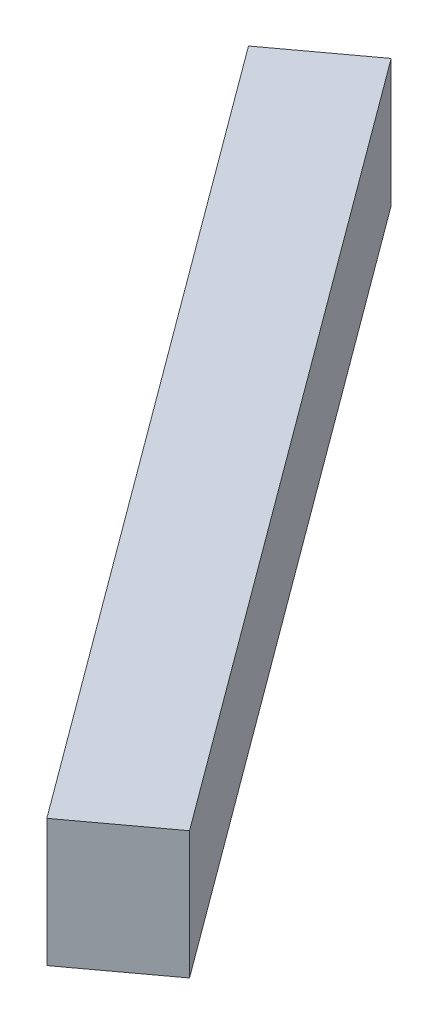
ISO-10303-21;
HEADER;
FILE_DESCRIPTION(('STEP AP214'),'2;1');
FILE_NAME('part.step','',(''),(''),'','','');
FILE_SCHEMA(('AUTOMOTIVE_DESIGN { 1 0 10303 214 1 1 1 1 }'));
ENDSEC;
DATA;
#1=APPLICATION_CONTEXT('core data for automotive mechanical design processes');
#2=APPLICATION_PROTOCOL_DEFINITION('international standard','automotive_design',2000,#1);
#3=PRODUCT_CONTEXT('',#1,'mechanical');
#4=PRODUCT('Part','Part','',(#3));
#5=PRODUCT_RELATED_PRODUCT_CATEGORY('part','',(#4));
#6=PRODUCT_DEFINITION_FORMATION('','',#4);
#7=PRODUCT_DEFINITION_CONTEXT('part definition',#1,'design');
#8=PRODUCT_DEFINITION('design','',#6,#7);
#9=PRODUCT_DEFINITION_SHAPE('','',#8);
#10=(LENGTH_UNIT() NAMED_UNIT(*) SI_UNIT(.MILLI.,.METRE.));
#11=(NAMED_UNIT(*) PLANE_ANGLE_UNIT() SI_UNIT($,.RADIAN.));
#12=(NAMED_UNIT(*) SI_UNIT($,.STERADIAN.) SOLID_ANGLE_UNIT());
#13=UNCERTAINTY_MEASURE_WITH_UNIT(LENGTH_MEASURE(1.E-05),#10,'distance_accuracy_value','');
#14=(GEOMETRIC_REPRESENTATION_CONTEXT(3) GLOBAL_UNCERTAINTY_ASSIGNED_CONTEXT((#13)) GLOBAL_UNIT_ASSIGNED_CONTEXT((#10,
#11,#12)) REPRESENTATION_CONTEXT('',''));
#15=CARTESIAN_POINT('',(0.,0.,0.));
#16=DIRECTION('',(0.,0.,1.));
#17=DIRECTION('',(1.,0.,0.));
#18=AXIS2_PLACEMENT_3D('',#15,#16,#17);
#19=CARTESIAN_POINT('',(-10.7673404934118,7.874,-14.4207640742536));
#20=DIRECTION('',(0.804603702078381,0.,-0.593812161042331));
#21=DIRECTION('',(-0.593812161042331,0.,-0.804603702078381));
#22=AXIS2_PLACEMENT_3D('',#19,#20,#21);
#23=PLANE('',#22);
#24=DIRECTION('',(0.,1.,0.));
#25=VECTOR('',#24,1.);
#26=CARTESIAN_POINT('',(-10.7673404934118,7.874,-14.4207640742536));
#27=LINE('',#26,#25);
#28=CARTESIAN_POINT('',(-10.7673404934118,7.62,-14.4207640742536));
#29=VERTEX_POINT('',#28);
#30=CARTESIAN_POINT('',(-10.7673404934118,7.874,-14.4207640742536));
#31=VERTEX_POINT('',#30);
#32=EDGE_CURVE('E20',#29,#31,#27,.T.);
#33=ORIENTED_EDGE('',*,*,#32,.T.);
#34=DIRECTION('',(0.593812161042297,0.,0.804603702078407));
#35=VECTOR('',#34,1.);
#36=CARTESIAN_POINT('',(-11.8985526601974,7.874,-15.953534126713));
#37=LINE('',#36,#35);
#38=CARTESIAN_POINT('',(-11.8985526601974,7.874,-15.953534126713));
#39=VERTEX_POINT('',#38);
#40=EDGE_CURVE('E55',#39,#31,#37,.T.);
#41=ORIENTED_EDGE('',*,*,#40,.F.);
#42=DIRECTION('',(0.,1.,0.));
#43=VECTOR('',#42,1.);
#44=CARTESIAN_POINT('',(-11.8985526601974,7.874,-15.953534126713));
#45=LINE('',#44,#43);
#46=CARTESIAN_POINT('',(-11.8985526601974,7.62,-15.953534126713));
#47=VERTEX_POINT('',#46);
#48=EDGE_CURVE('E76',#39,#47,#45,.F.);
#49=ORIENTED_EDGE('',*,*,#48,.T.);
#50=DIRECTION('',(0.593812161042297,0.,0.804603702078407));
#51=VECTOR('',#50,1.);
#52=CARTESIAN_POINT('',(-11.8985526601974,7.62,-15.953534126713));
#53=LINE('',#52,#51);
#54=EDGE_CURVE('E58',#47,#29,#53,.T.);
#55=ORIENTED_EDGE('',*,*,#54,.T.);
#56=EDGE_LOOP('',(#33,#41,#49,#55));
#57=FACE_BOUND('',#56,.T.);
#58=ADVANCED_FACE('F17',(#57),#23,.F.);
#59=CARTESIAN_POINT('',(-10.7673404934118,7.874,-14.4207640742536));
#60=DIRECTION('',(-0.593812161042352,0.,-0.804603702078366));
#61=DIRECTION('',(-0.804603702078366,0.,0.593812161042352));
#62=AXIS2_PLACEMENT_3D('',#59,#60,#61);
#63=PLANE('',#62);
#64=DIRECTION('',(0.,1.,0.));
#65=VECTOR('',#64,1.);
#66=CARTESIAN_POINT('',(-10.6038450211494,7.874,-14.5414267053774));
#67=LINE('',#66,#65);
#68=CARTESIAN_POINT('',(-10.6038450211494,7.62,-14.5414267053774));
#69=VERTEX_POINT('',#68);
#70=CARTESIAN_POINT('',(-10.6038450211494,7.874,-14.5414267053774));
#71=VERTEX_POINT('',#70);
#72=EDGE_CURVE('E73',#69,#71,#67,.T.);
#73=ORIENTED_EDGE('',*,*,#72,.T.);
#74=DIRECTION('',(0.804603702078511,0.,-0.593812161042156));
#75=VECTOR('',#74,1.);
#76=CARTESIAN_POINT('',(-10.7673404934118,7.874,-14.4207640742536));
#77=LINE('',#76,#75);
#78=EDGE_CURVE('E63',#31,#71,#77,.T.);
#79=ORIENTED_EDGE('',*,*,#78,.F.);
#80=ORIENTED_EDGE('',*,*,#32,.F.);
#81=DIRECTION('',(0.804603702078511,0.,-0.593812161042156));
#82=VECTOR('',#81,1.);
#83=CARTESIAN_POINT('',(-10.7673404934118,7.62,-14.4207640742536));
#84=LINE('',#83,#82);
#85=EDGE_CURVE('E80',#29,#69,#84,.T.);
#86=ORIENTED_EDGE('',*,*,#85,.T.);
#87=EDGE_LOOP('',(#73,#79,#80,#86));
#88=FACE_BOUND('',#87,.T.);
#89=ADVANCED_FACE('F72',(#88),#63,.F.);
#90=CARTESIAN_POINT('',(-10.6038450211494,7.874,-14.5414267053774));
#91=DIRECTION('',(0.,1.,0.));
#92=DIRECTION('',(0.,0.,1.));
#93=AXIS2_PLACEMENT_3D('',#90,#91,#92);
#94=PLANE('',#93);
#95=DIRECTION('',(0.804603701174414,0.,-0.593812162267188));
#96=VECTOR('',#95,1.);
#97=CARTESIAN_POINT('',(-11.8985526601974,7.874,-15.953534126713));
#98=LINE('',#97,#96);
#99=CARTESIAN_POINT('',(-11.7350571881188,7.874,-16.0741967580857));
#100=VERTEX_POINT('',#99);
#101=EDGE_CURVE('E69',#100,#39,#98,.F.);
#102=ORIENTED_EDGE('',*,*,#101,.T.);
#103=ORIENTED_EDGE('',*,*,#40,.T.);
#104=ORIENTED_EDGE('',*,*,#78,.T.);
#105=DIRECTION('',(0.593812161042333,0.,0.80460370207838));
#106=VECTOR('',#105,1.);
#107=CARTESIAN_POINT('',(-10.6038450211494,7.874,-14.5414267053774));
#108=LINE('',#107,#106);
#109=EDGE_CURVE('E83',#71,#100,#108,.F.);
#110=ORIENTED_EDGE('',*,*,#109,.T.);
#111=EDGE_LOOP('',(#102,#103,#104,#110));
#112=FACE_BOUND('',#111,.T.);
#113=ADVANCED_FACE('F66',(#112),#94,.T.);
#114=CARTESIAN_POINT('',(-11.8985526601974,7.874,-15.953534126713));
#115=DIRECTION('',(0.593812162267188,0.,0.804603701174415));
#116=DIRECTION('',(0.804603701174414,0.,-0.593812162267188));
#117=AXIS2_PLACEMENT_3D('',#114,#115,#116);
#118=PLANE('',#117);
#119=ORIENTED_EDGE('',*,*,#48,.F.);
#120=ORIENTED_EDGE('',*,*,#101,.F.);
#121=DIRECTION('',(0.,1.,0.));
#122=VECTOR('',#121,1.);
#123=CARTESIAN_POINT('',(-11.7350571881188,7.874,-16.0741967580857));
#124=LINE('',#123,#122);
#125=CARTESIAN_POINT('',(-11.7350571881188,7.62,-16.0741967580857));
#126=VERTEX_POINT('',#125);
#127=EDGE_CURVE('E26',#100,#126,#124,.F.);
#128=ORIENTED_EDGE('',*,*,#127,.T.);
#129=DIRECTION('',(-0.804603701174323,0.,0.593812162267312));
#130=VECTOR('',#129,1.);
#131=CARTESIAN_POINT('',(-11.7350571881188,7.62,-16.0741967580857));
#132=LINE('',#131,#130);
#133=EDGE_CURVE('E34',#126,#47,#132,.T.);
#134=ORIENTED_EDGE('',*,*,#133,.T.);
#135=EDGE_LOOP('',(#119,#120,#128,#134));
#136=FACE_BOUND('',#135,.T.);
#137=ADVANCED_FACE('F88',(#136),#118,.F.);
#138=CARTESIAN_POINT('',(-10.6038450211494,7.62,-14.5414267053774));
#139=DIRECTION('',(0.,1.,0.));
#140=DIRECTION('',(0.,0.,1.));
#141=AXIS2_PLACEMENT_3D('',#138,#139,#140);
#142=PLANE('',#141);
#143=ORIENTED_EDGE('',*,*,#54,.F.);
#144=ORIENTED_EDGE('',*,*,#133,.F.);
#145=DIRECTION('',(0.593812161042333,0.,0.80460370207838));
#146=VECTOR('',#145,1.);
#147=CARTESIAN_POINT('',(-10.6038450211494,7.62,-14.5414267053774));
#148=LINE('',#147,#146);
#149=EDGE_CURVE('E11',#126,#69,#148,.T.);
#150=ORIENTED_EDGE('',*,*,#149,.T.);
#151=ORIENTED_EDGE('',*,*,#85,.F.);
#152=EDGE_LOOP('',(#143,#144,#150,#151));
#153=FACE_BOUND('',#152,.T.);
#154=ADVANCED_FACE('F91',(#153),#142,.F.);
#155=CARTESIAN_POINT('',(-10.6038450211494,7.874,-14.5414267053774));
#156=DIRECTION('',(-0.80460370207838,0.,0.593812161042333));
#157=DIRECTION('',(0.593812161042333,0.,0.80460370207838));
#158=AXIS2_PLACEMENT_3D('',#155,#156,#157);
#159=PLANE('',#158);
#160=ORIENTED_EDGE('',*,*,#127,.F.);
#161=ORIENTED_EDGE('',*,*,#109,.F.);
#162=ORIENTED_EDGE('',*,*,#72,.F.);
#163=ORIENTED_EDGE('',*,*,#149,.F.);
#164=EDGE_LOOP('',(#160,#161,#162,#163));
#165=FACE_BOUND('',#164,.T.);
#166=ADVANCED_FACE('F90',(#165),#159,.F.);
#167=CLOSED_SHELL('',(#58,#89,#113,#137,#154,#166));
#168=MANIFOLD_SOLID_BREP('B1',#167);
#169=ADVANCED_BREP_SHAPE_REPRESENTATION('',(#18,#168),#14);
#170=SHAPE_DEFINITION_REPRESENTATION(#9,#169);
ENDSEC;
END-ISO-10303-21;
